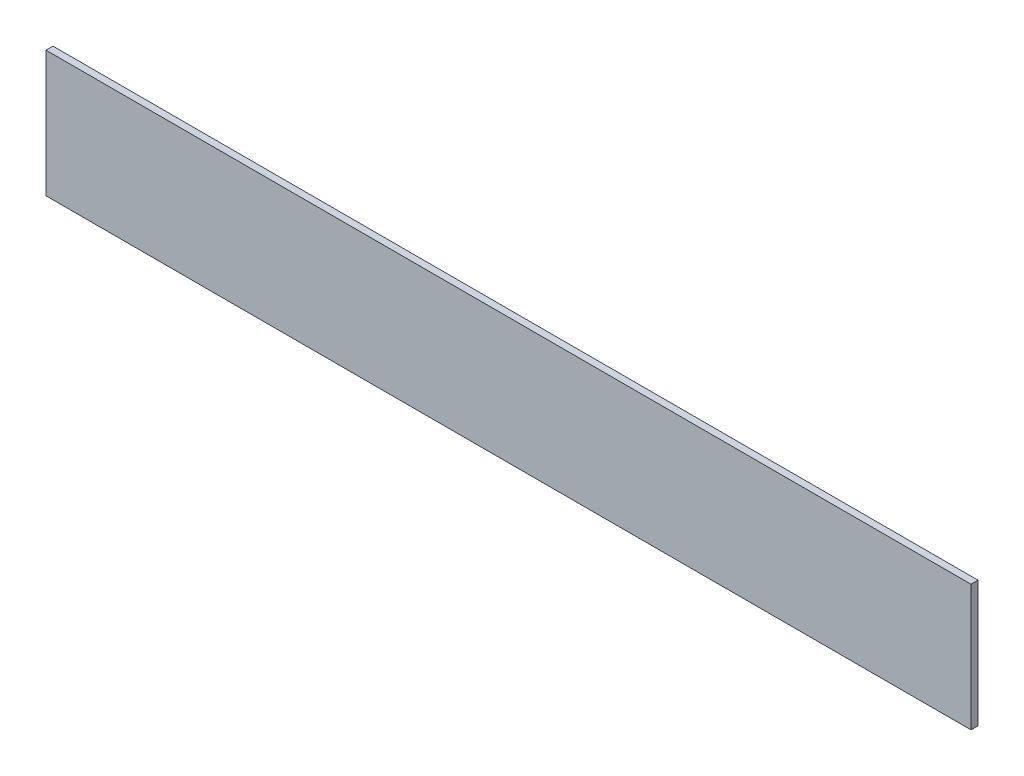
ISO-10303-21;
HEADER;
FILE_DESCRIPTION(('STEP AP214'),'2;1');
FILE_NAME('part.step','',(''),(''),'','','');
FILE_SCHEMA(('AUTOMOTIVE_DESIGN { 1 0 10303 214 1 1 1 1 }'));
ENDSEC;
DATA;
#1=APPLICATION_CONTEXT('core data for automotive mechanical design processes');
#2=APPLICATION_PROTOCOL_DEFINITION('international standard','automotive_design',2000,#1);
#3=PRODUCT_CONTEXT('',#1,'mechanical');
#4=PRODUCT('Part','Part','',(#3));
#5=PRODUCT_RELATED_PRODUCT_CATEGORY('part','',(#4));
#6=PRODUCT_DEFINITION_FORMATION('','',#4);
#7=PRODUCT_DEFINITION_CONTEXT('part definition',#1,'design');
#8=PRODUCT_DEFINITION('design','',#6,#7);
#9=PRODUCT_DEFINITION_SHAPE('','',#8);
#10=(LENGTH_UNIT() NAMED_UNIT(*) SI_UNIT(.MILLI.,.METRE.));
#11=(NAMED_UNIT(*) PLANE_ANGLE_UNIT() SI_UNIT($,.RADIAN.));
#12=(NAMED_UNIT(*) SI_UNIT($,.STERADIAN.) SOLID_ANGLE_UNIT());
#13=UNCERTAINTY_MEASURE_WITH_UNIT(LENGTH_MEASURE(1.E-05),#10,'distance_accuracy_value','');
#14=(GEOMETRIC_REPRESENTATION_CONTEXT(3) GLOBAL_UNCERTAINTY_ASSIGNED_CONTEXT((#13)) GLOBAL_UNIT_ASSIGNED_CONTEXT((#10,
#11,#12)) REPRESENTATION_CONTEXT('',''));
#15=CARTESIAN_POINT('',(0.,0.,0.));
#16=DIRECTION('',(0.,0.,1.));
#17=DIRECTION('',(1.,0.,0.));
#18=AXIS2_PLACEMENT_3D('',#15,#16,#17);
#19=CARTESIAN_POINT('',(185.,552.,-565.));
#20=DIRECTION('',(-1.,0.,0.));
#21=DIRECTION('',(0.,0.,1.));
#22=AXIS2_PLACEMENT_3D('',#19,#20,#21);
#23=PLANE('',#22);
#24=DIRECTION('',(0.,-1.,0.));
#25=VECTOR('',#24,1.);
#26=CARTESIAN_POINT('',(185.,552.,-562.5));
#27=LINE('',#26,#25);
#28=CARTESIAN_POINT('',(185.,597.,-562.5));
#29=VERTEX_POINT('',#28);
#30=CARTESIAN_POINT('',(185.,552.,-562.5));
#31=VERTEX_POINT('',#30);
#32=EDGE_CURVE('E103',#29,#31,#27,.T.);
#33=ORIENTED_EDGE('',*,*,#32,.F.);
#34=DIRECTION('',(0.,0.,1.));
#35=VECTOR('',#34,1.);
#36=CARTESIAN_POINT('',(185.,597.,-565.));
#37=LINE('',#36,#35);
#38=CARTESIAN_POINT('',(185.,597.,-565.));
#39=VERTEX_POINT('',#38);
#40=EDGE_CURVE('E11',#39,#29,#37,.T.);
#41=ORIENTED_EDGE('',*,*,#40,.F.);
#42=DIRECTION('',(0.,-1.,0.));
#43=VECTOR('',#42,1.);
#44=CARTESIAN_POINT('',(185.,552.,-565.));
#45=LINE('',#44,#43);
#46=CARTESIAN_POINT('',(185.,552.,-565.));
#47=VERTEX_POINT('',#46);
#48=EDGE_CURVE('E97',#39,#47,#45,.T.);
#49=ORIENTED_EDGE('',*,*,#48,.T.);
#50=DIRECTION('',(0.,0.,1.));
#51=VECTOR('',#50,1.);
#52=CARTESIAN_POINT('',(185.,552.,-565.));
#53=LINE('',#52,#51);
#54=EDGE_CURVE('E42',#47,#31,#53,.T.);
#55=ORIENTED_EDGE('',*,*,#54,.T.);
#56=EDGE_LOOP('',(#33,#41,#49,#55));
#57=FACE_BOUND('',#56,.T.);
#58=ADVANCED_FACE('F39',(#57),#23,.T.);
#59=CARTESIAN_POINT('',(185.,597.,-565.));
#60=DIRECTION('',(0.,1.,0.));
#61=DIRECTION('',(0.,0.,1.));
#62=AXIS2_PLACEMENT_3D('',#59,#60,#61);
#63=PLANE('',#62);
#64=DIRECTION('',(-1.,0.,0.));
#65=VECTOR('',#64,1.);
#66=CARTESIAN_POINT('',(185.,597.,-562.5));
#67=LINE('',#66,#65);
#68=CARTESIAN_POINT('',(515.,597.,-562.5));
#69=VERTEX_POINT('',#68);
#70=EDGE_CURVE('E99',#69,#29,#67,.T.);
#71=ORIENTED_EDGE('',*,*,#70,.F.);
#72=DIRECTION('',(0.,0.,1.));
#73=VECTOR('',#72,1.);
#74=CARTESIAN_POINT('',(515.,597.,-565.));
#75=LINE('',#74,#73);
#76=CARTESIAN_POINT('',(515.,597.,-565.));
#77=VERTEX_POINT('',#76);
#78=EDGE_CURVE('E48',#77,#69,#75,.T.);
#79=ORIENTED_EDGE('',*,*,#78,.F.);
#80=DIRECTION('',(-1.,0.,0.));
#81=VECTOR('',#80,1.);
#82=CARTESIAN_POINT('',(185.,597.,-565.));
#83=LINE('',#82,#81);
#84=EDGE_CURVE('E94',#77,#39,#83,.T.);
#85=ORIENTED_EDGE('',*,*,#84,.T.);
#86=ORIENTED_EDGE('',*,*,#40,.T.);
#87=EDGE_LOOP('',(#71,#79,#85,#86));
#88=FACE_BOUND('',#87,.T.);
#89=ADVANCED_FACE('F113',(#88),#63,.T.);
#90=CARTESIAN_POINT('',(515.,552.,-565.));
#91=DIRECTION('',(1.,0.,0.));
#92=DIRECTION('',(0.,0.,-1.));
#93=AXIS2_PLACEMENT_3D('',#90,#91,#92);
#94=PLANE('',#93);
#95=DIRECTION('',(0.,1.,0.));
#96=VECTOR('',#95,1.);
#97=CARTESIAN_POINT('',(515.,552.,-562.5));
#98=LINE('',#97,#96);
#99=CARTESIAN_POINT('',(515.,552.,-562.5));
#100=VERTEX_POINT('',#99);
#101=EDGE_CURVE('E89',#100,#69,#98,.T.);
#102=ORIENTED_EDGE('',*,*,#101,.F.);
#103=DIRECTION('',(0.,0.,1.));
#104=VECTOR('',#103,1.);
#105=CARTESIAN_POINT('',(515.,552.,-565.));
#106=LINE('',#105,#104);
#107=CARTESIAN_POINT('',(515.,552.,-565.));
#108=VERTEX_POINT('',#107);
#109=EDGE_CURVE('E84',#108,#100,#106,.T.);
#110=ORIENTED_EDGE('',*,*,#109,.F.);
#111=DIRECTION('',(0.,1.,0.));
#112=VECTOR('',#111,1.);
#113=CARTESIAN_POINT('',(515.,552.,-565.));
#114=LINE('',#113,#112);
#115=EDGE_CURVE('E87',#108,#77,#114,.T.);
#116=ORIENTED_EDGE('',*,*,#115,.T.);
#117=ORIENTED_EDGE('',*,*,#78,.T.);
#118=EDGE_LOOP('',(#102,#110,#116,#117));
#119=FACE_BOUND('',#118,.T.);
#120=ADVANCED_FACE('F86',(#119),#94,.T.);
#121=CARTESIAN_POINT('',(185.,552.,-565.));
#122=DIRECTION('',(0.,-1.,0.));
#123=DIRECTION('',(0.,0.,-1.));
#124=AXIS2_PLACEMENT_3D('',#121,#122,#123);
#125=PLANE('',#124);
#126=DIRECTION('',(1.,0.,0.));
#127=VECTOR('',#126,1.);
#128=CARTESIAN_POINT('',(185.,552.,-562.5));
#129=LINE('',#128,#127);
#130=EDGE_CURVE('E106',#31,#100,#129,.T.);
#131=ORIENTED_EDGE('',*,*,#130,.F.);
#132=ORIENTED_EDGE('',*,*,#54,.F.);
#133=DIRECTION('',(1.,0.,0.));
#134=VECTOR('',#133,1.);
#135=CARTESIAN_POINT('',(185.,552.,-565.));
#136=LINE('',#135,#134);
#137=EDGE_CURVE('E93',#47,#108,#136,.T.);
#138=ORIENTED_EDGE('',*,*,#137,.T.);
#139=ORIENTED_EDGE('',*,*,#109,.T.);
#140=EDGE_LOOP('',(#131,#132,#138,#139));
#141=FACE_BOUND('',#140,.T.);
#142=ADVANCED_FACE('F96',(#141),#125,.T.);
#143=CARTESIAN_POINT('',(0.,0.,-565.));
#144=DIRECTION('',(0.,0.,-1.));
#145=DIRECTION('',(-1.,0.,0.));
#146=AXIS2_PLACEMENT_3D('',#143,#144,#145);
#147=PLANE('',#146);
#148=ORIENTED_EDGE('',*,*,#48,.F.);
#149=ORIENTED_EDGE('',*,*,#84,.F.);
#150=ORIENTED_EDGE('',*,*,#115,.F.);
#151=ORIENTED_EDGE('',*,*,#137,.F.);
#152=EDGE_LOOP('',(#148,#149,#150,#151));
#153=FACE_BOUND('',#152,.T.);
#154=ADVANCED_FACE('F92',(#153),#147,.T.);
#155=CARTESIAN_POINT('',(0.,0.,-562.5));
#156=DIRECTION('',(0.,0.,-1.));
#157=DIRECTION('',(-1.,0.,0.));
#158=AXIS2_PLACEMENT_3D('',#155,#156,#157);
#159=PLANE('',#158);
#160=ORIENTED_EDGE('',*,*,#32,.T.);
#161=ORIENTED_EDGE('',*,*,#130,.T.);
#162=ORIENTED_EDGE('',*,*,#101,.T.);
#163=ORIENTED_EDGE('',*,*,#70,.T.);
#164=EDGE_LOOP('',(#160,#161,#162,#163));
#165=FACE_BOUND('',#164,.T.);
#166=ADVANCED_FACE('F112',(#165),#159,.F.);
#167=CLOSED_SHELL('',(#58,#89,#120,#142,#154,#166));
#168=MANIFOLD_SOLID_BREP('B2',#167);
#169=ADVANCED_BREP_SHAPE_REPRESENTATION('',(#18,#168),#14);
#170=SHAPE_DEFINITION_REPRESENTATION(#9,#169);
ENDSEC;
END-ISO-10303-21;
